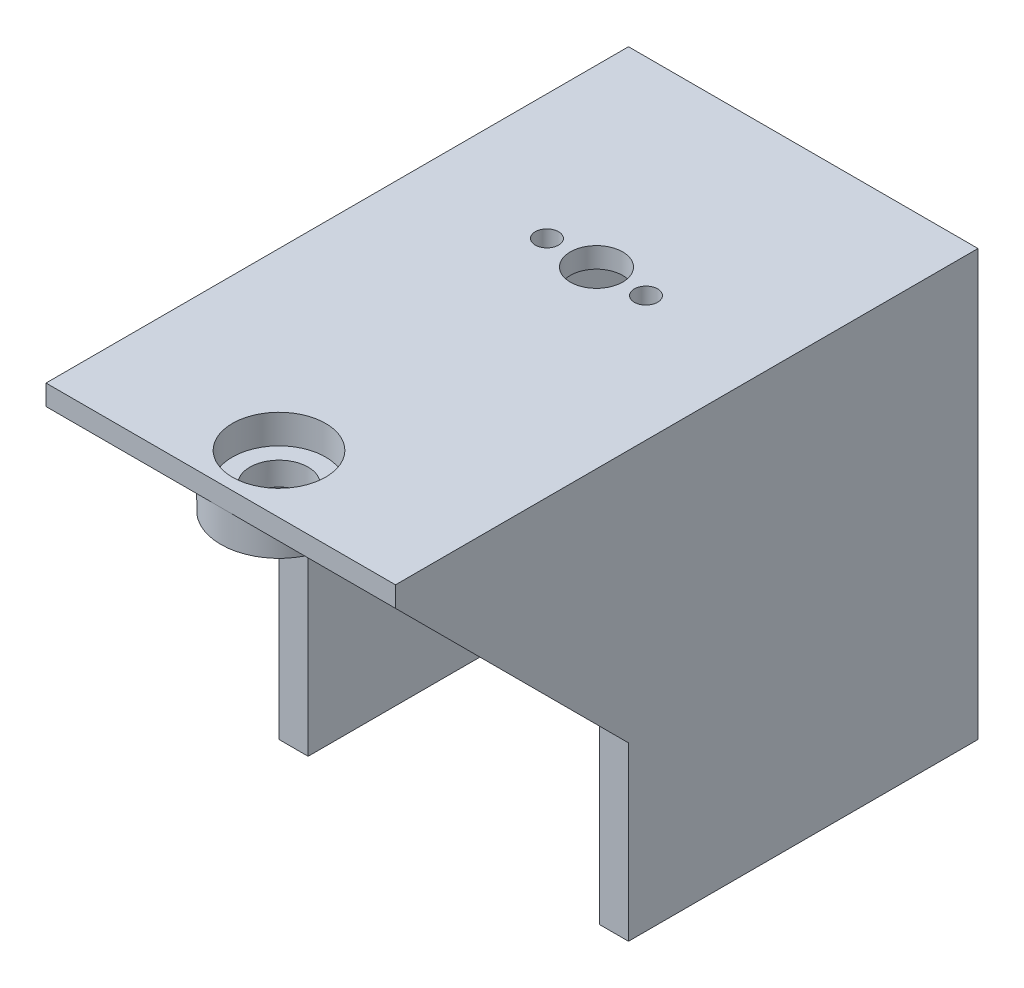
ISO-10303-21;
HEADER;
FILE_DESCRIPTION(('STEP AP214'),'2;1');
FILE_NAME('part.step','',(''),(''),'','','');
FILE_SCHEMA(('AUTOMOTIVE_DESIGN { 1 0 10303 214 1 1 1 1 }'));
ENDSEC;
DATA;
#1=APPLICATION_CONTEXT('core data for automotive mechanical design processes');
#2=APPLICATION_PROTOCOL_DEFINITION('international standard','automotive_design',2000,#1);
#3=PRODUCT_CONTEXT('',#1,'mechanical');
#4=PRODUCT('Part','Part','',(#3));
#5=PRODUCT_RELATED_PRODUCT_CATEGORY('part','',(#4));
#6=PRODUCT_DEFINITION_FORMATION('','',#4);
#7=PRODUCT_DEFINITION_CONTEXT('part definition',#1,'design');
#8=PRODUCT_DEFINITION('design','',#6,#7);
#9=PRODUCT_DEFINITION_SHAPE('','',#8);
#10=(LENGTH_UNIT() NAMED_UNIT(*) SI_UNIT(.MILLI.,.METRE.));
#11=(NAMED_UNIT(*) PLANE_ANGLE_UNIT() SI_UNIT($,.RADIAN.));
#12=(NAMED_UNIT(*) SI_UNIT($,.STERADIAN.) SOLID_ANGLE_UNIT());
#13=UNCERTAINTY_MEASURE_WITH_UNIT(LENGTH_MEASURE(1.E-05),#10,'distance_accuracy_value','');
#14=(GEOMETRIC_REPRESENTATION_CONTEXT(3) GLOBAL_UNCERTAINTY_ASSIGNED_CONTEXT((#13)) GLOBAL_UNIT_ASSIGNED_CONTEXT((#10,
#11,#12)) REPRESENTATION_CONTEXT('',''));
#15=CARTESIAN_POINT('',(0.,0.,0.));
#16=DIRECTION('',(0.,0.,1.));
#17=DIRECTION('',(1.,0.,0.));
#18=AXIS2_PLACEMENT_3D('',#15,#16,#17);
#19=CARTESIAN_POINT('',(-30.,73.,30.));
#20=DIRECTION('',(0.,0.,-1.));
#21=DIRECTION('',(-1.,0.,0.));
#22=AXIS2_PLACEMENT_3D('',#19,#20,#21);
#23=PLANE('',#22);
#24=DIRECTION('',(0.,-1.,0.));
#25=VECTOR('',#24,1.);
#26=CARTESIAN_POINT('',(-25.,0.,30.));
#27=LINE('',#26,#25);
#28=CARTESIAN_POINT('',(-25.,29.5000000000001,30.));
#29=VERTEX_POINT('',#28);
#30=CARTESIAN_POINT('',(-25.,0.,30.));
#31=VERTEX_POINT('',#30);
#32=EDGE_CURVE('E305',#29,#31,#27,.T.);
#33=ORIENTED_EDGE('',*,*,#32,.F.);
#34=DIRECTION('',(-1.,0.,0.));
#35=VECTOR('',#34,1.);
#36=CARTESIAN_POINT('',(-30.,29.5000000000001,30.));
#37=LINE('',#36,#35);
#38=CARTESIAN_POINT('',(-30.,29.5000000000001,30.));
#39=VERTEX_POINT('',#38);
#40=EDGE_CURVE('E251',#29,#39,#37,.T.);
#41=ORIENTED_EDGE('',*,*,#40,.T.);
#42=DIRECTION('',(0.,-1.,0.));
#43=VECTOR('',#42,1.);
#44=CARTESIAN_POINT('',(-30.,73.,30.));
#45=LINE('',#44,#43);
#46=CARTESIAN_POINT('',(-30.,0.,30.));
#47=VERTEX_POINT('',#46);
#48=EDGE_CURVE('E167',#39,#47,#45,.T.);
#49=ORIENTED_EDGE('',*,*,#48,.T.);
#50=DIRECTION('',(1.,0.,0.));
#51=VECTOR('',#50,1.);
#52=CARTESIAN_POINT('',(-30.,0.,30.));
#53=LINE('',#52,#51);
#54=EDGE_CURVE('E210',#47,#31,#53,.T.);
#55=ORIENTED_EDGE('',*,*,#54,.T.);
#56=EDGE_LOOP('',(#33,#41,#49,#55));
#57=FACE_BOUND('',#56,.T.);
#58=ADVANCED_FACE('F43',(#57),#23,.F.);
#59=DIRECTION('',(0.,-1.,0.));
#60=VECTOR('',#59,1.);
#61=CARTESIAN_POINT('',(30.,73.,30.));
#62=LINE('',#61,#60);
#63=CARTESIAN_POINT('',(30.,29.5000000000001,30.));
#64=VERTEX_POINT('',#63);
#65=CARTESIAN_POINT('',(30.,0.,30.));
#66=VERTEX_POINT('',#65);
#67=EDGE_CURVE('E222',#64,#66,#62,.T.);
#68=ORIENTED_EDGE('',*,*,#67,.F.);
#69=DIRECTION('',(-1.,0.,0.));
#70=VECTOR('',#69,1.);
#71=CARTESIAN_POINT('',(20.,29.5000000000001,30.));
#72=LINE('',#71,#70);
#73=CARTESIAN_POINT('',(25.,29.5000000000001,30.));
#74=VERTEX_POINT('',#73);
#75=EDGE_CURVE('E249',#64,#74,#72,.T.);
#76=ORIENTED_EDGE('',*,*,#75,.T.);
#77=DIRECTION('',(0.,1.,0.));
#78=VECTOR('',#77,1.);
#79=CARTESIAN_POINT('',(25.,0.,30.));
#80=LINE('',#79,#78);
#81=CARTESIAN_POINT('',(25.,0.,30.));
#82=VERTEX_POINT('',#81);
#83=EDGE_CURVE('E300',#82,#74,#80,.T.);
#84=ORIENTED_EDGE('',*,*,#83,.F.);
#85=EDGE_CURVE('E215',#82,#66,#53,.T.);
#86=ORIENTED_EDGE('',*,*,#85,.T.);
#87=EDGE_LOOP('',(#68,#76,#84,#86));
#88=FACE_BOUND('',#87,.T.);
#89=ADVANCED_FACE('F370',(#88),#23,.F.);
#90=CARTESIAN_POINT('',(0.,0.,0.));
#91=DIRECTION('',(0.,-1.,0.));
#92=DIRECTION('',(0.,0.,-1.));
#93=AXIS2_PLACEMENT_3D('',#90,#91,#92);
#94=PLANE('',#93);
#95=CARTESIAN_POINT('',(-27.5,0.,0.));
#96=DIRECTION('',(0.,-1.,0.));
#97=DIRECTION('',(0.,0.,-1.));
#98=AXIS2_PLACEMENT_3D('',#95,#96,#97);
#99=CIRCLE('',#98,1.69999999999999);
#100=CARTESIAN_POINT('',(-27.5,0.,-1.69999999999999));
#101=VERTEX_POINT('',#100);
#102=EDGE_CURVE('E360',#101,#101,#99,.T.);
#103=ORIENTED_EDGE('',*,*,#102,.F.);
#104=EDGE_LOOP('',(#103));
#105=FACE_BOUND('',#104,.T.);
#106=CARTESIAN_POINT('',(-27.5,0.,20.));
#107=DIRECTION('',(0.,-1.,0.));
#108=DIRECTION('',(0.,0.,-1.));
#109=AXIS2_PLACEMENT_3D('',#106,#107,#108);
#110=CIRCLE('',#109,1.69999999999999);
#111=CARTESIAN_POINT('',(-27.5,0.,18.3));
#112=VERTEX_POINT('',#111);
#113=EDGE_CURVE('E348',#112,#112,#110,.T.);
#114=ORIENTED_EDGE('',*,*,#113,.F.);
#115=EDGE_LOOP('',(#114));
#116=FACE_BOUND('',#115,.T.);
#117=CARTESIAN_POINT('',(-27.5,0.,-20.));
#118=DIRECTION('',(0.,-1.,0.));
#119=DIRECTION('',(0.,0.,-1.));
#120=AXIS2_PLACEMENT_3D('',#117,#118,#119);
#121=CIRCLE('',#120,1.69999999999999);
#122=CARTESIAN_POINT('',(-27.5,0.,-21.7));
#123=VERTEX_POINT('',#122);
#124=EDGE_CURVE('E342',#123,#123,#121,.T.);
#125=ORIENTED_EDGE('',*,*,#124,.F.);
#126=EDGE_LOOP('',(#125));
#127=FACE_BOUND('',#126,.T.);
#128=DIRECTION('',(0.,0.,1.));
#129=VECTOR('',#128,1.);
#130=CARTESIAN_POINT('',(-25.,0.,-30.001));
#131=LINE('',#130,#129);
#132=CARTESIAN_POINT('',(-25.,0.,-30.));
#133=VERTEX_POINT('',#132);
#134=EDGE_CURVE('E218',#133,#31,#131,.T.);
#135=ORIENTED_EDGE('',*,*,#134,.T.);
#136=ORIENTED_EDGE('',*,*,#54,.F.);
#137=DIRECTION('',(0.,0.,1.));
#138=VECTOR('',#137,1.);
#139=CARTESIAN_POINT('',(-30.,0.,30.));
#140=LINE('',#139,#138);
#141=CARTESIAN_POINT('',(-30.,0.,-30.));
#142=VERTEX_POINT('',#141);
#143=EDGE_CURVE('E230',#142,#47,#140,.T.);
#144=ORIENTED_EDGE('',*,*,#143,.F.);
#145=DIRECTION('',(-1.,0.,0.));
#146=VECTOR('',#145,1.);
#147=CARTESIAN_POINT('',(-30.,0.,-30.));
#148=LINE('',#147,#146);
#149=EDGE_CURVE('E225',#133,#142,#148,.T.);
#150=ORIENTED_EDGE('',*,*,#149,.F.);
#151=EDGE_LOOP('',(#135,#136,#144,#150));
#152=FACE_BOUND('',#151,.T.);
#153=ADVANCED_FACE('F367',(#105,#116,#127,#152),#94,.T.);
#154=CARTESIAN_POINT('',(30.,73.,30.));
#155=DIRECTION('',(-1.,0.,0.));
#156=DIRECTION('',(0.,0.,1.));
#157=AXIS2_PLACEMENT_3D('',#154,#155,#156);
#158=PLANE('',#157);
#159=DIRECTION('',(0.,0.,-1.));
#160=VECTOR('',#159,1.);
#161=CARTESIAN_POINT('',(30.,0.,30.));
#162=LINE('',#161,#160);
#163=CARTESIAN_POINT('',(30.,0.,-30.));
#164=VERTEX_POINT('',#163);
#165=EDGE_CURVE('E223',#66,#164,#162,.T.);
#166=ORIENTED_EDGE('',*,*,#165,.T.);
#167=DIRECTION('',(0.,-1.,0.));
#168=VECTOR('',#167,1.);
#169=CARTESIAN_POINT('',(30.,73.,-30.));
#170=LINE('',#169,#168);
#171=CARTESIAN_POINT('',(30.,73.,-30.));
#172=VERTEX_POINT('',#171);
#173=EDGE_CURVE('E207',#172,#164,#170,.T.);
#174=ORIENTED_EDGE('',*,*,#173,.F.);
#175=DIRECTION('',(0.,0.,-1.));
#176=VECTOR('',#175,1.);
#177=CARTESIAN_POINT('',(30.,73.,30.));
#178=LINE('',#177,#176);
#179=CARTESIAN_POINT('',(30.,73.,70.));
#180=VERTEX_POINT('',#179);
#181=EDGE_CURVE('E205',#180,#172,#178,.T.);
#182=ORIENTED_EDGE('',*,*,#181,.F.);
#183=DIRECTION('',(0.,1.,0.));
#184=VECTOR('',#183,1.);
#185=CARTESIAN_POINT('',(30.,73.,70.));
#186=LINE('',#185,#184);
#187=CARTESIAN_POINT('',(30.,69.5,70.));
#188=VERTEX_POINT('',#187);
#189=EDGE_CURVE('E186',#188,#180,#186,.T.);
#190=ORIENTED_EDGE('',*,*,#189,.F.);
#191=DIRECTION('',(0.,0.707106781186544,0.707106781186551));
#192=VECTOR('',#191,1.);
#193=CARTESIAN_POINT('',(30.,51.2499999999998,51.7499999999999));
#194=LINE('',#193,#192);
#195=EDGE_CURVE('E201',#188,#64,#194,.F.);
#196=ORIENTED_EDGE('',*,*,#195,.T.);
#197=ORIENTED_EDGE('',*,*,#67,.T.);
#198=EDGE_LOOP('',(#166,#174,#182,#190,#196,#197));
#199=FACE_BOUND('',#198,.T.);
#200=ADVANCED_FACE('F200',(#199),#158,.F.);
#201=CARTESIAN_POINT('',(-30.,73.,-30.));
#202=DIRECTION('',(0.,0.,1.));
#203=DIRECTION('',(1.,0.,0.));
#204=AXIS2_PLACEMENT_3D('',#201,#202,#203);
#205=PLANE('',#204);
#206=DIRECTION('',(1.,0.,0.));
#207=VECTOR('',#206,1.);
#208=CARTESIAN_POINT('',(-25.,69.5,-30.));
#209=LINE('',#208,#207);
#210=CARTESIAN_POINT('',(-20.,69.5,-30.));
#211=VERTEX_POINT('',#210);
#212=CARTESIAN_POINT('',(20.,69.5,-30.));
#213=VERTEX_POINT('',#212);
#214=EDGE_CURVE('E288',#211,#213,#209,.T.);
#215=ORIENTED_EDGE('',*,*,#214,.F.);
#216=DIRECTION('',(0.707106781186545,0.70710678118655,0.));
#217=VECTOR('',#216,1.);
#218=CARTESIAN_POINT('',(-23.25,66.25,-30.));
#219=LINE('',#218,#217);
#220=CARTESIAN_POINT('',(-25.,64.5,-30.));
#221=VERTEX_POINT('',#220);
#222=EDGE_CURVE('E247',#211,#221,#219,.F.);
#223=ORIENTED_EDGE('',*,*,#222,.T.);
#224=DIRECTION('',(0.,1.,0.));
#225=VECTOR('',#224,1.);
#226=CARTESIAN_POINT('',(-25.,0.,-30.));
#227=LINE('',#226,#225);
#228=EDGE_CURVE('E308',#133,#221,#227,.T.);
#229=ORIENTED_EDGE('',*,*,#228,.F.);
#230=ORIENTED_EDGE('',*,*,#149,.T.);
#231=DIRECTION('',(0.,-1.,0.));
#232=VECTOR('',#231,1.);
#233=CARTESIAN_POINT('',(-30.,73.,-30.));
#234=LINE('',#233,#232);
#235=CARTESIAN_POINT('',(-30.,73.,-30.));
#236=VERTEX_POINT('',#235);
#237=EDGE_CURVE('E234',#236,#142,#234,.T.);
#238=ORIENTED_EDGE('',*,*,#237,.F.);
#239=DIRECTION('',(-1.,0.,0.));
#240=VECTOR('',#239,1.);
#241=CARTESIAN_POINT('',(-30.,73.,-30.));
#242=LINE('',#241,#240);
#243=EDGE_CURVE('E209',#172,#236,#242,.T.);
#244=ORIENTED_EDGE('',*,*,#243,.F.);
#245=ORIENTED_EDGE('',*,*,#173,.T.);
#246=CARTESIAN_POINT('',(25.,0.,-30.));
#247=VERTEX_POINT('',#246);
#248=EDGE_CURVE('E227',#164,#247,#148,.T.);
#249=ORIENTED_EDGE('',*,*,#248,.T.);
#250=DIRECTION('',(0.,-1.,0.));
#251=VECTOR('',#250,1.);
#252=CARTESIAN_POINT('',(25.,0.,-30.));
#253=LINE('',#252,#251);
#254=CARTESIAN_POINT('',(25.,64.5,-30.));
#255=VERTEX_POINT('',#254);
#256=EDGE_CURVE('E313',#255,#247,#253,.T.);
#257=ORIENTED_EDGE('',*,*,#256,.F.);
#258=DIRECTION('',(0.707106781186551,-0.707106781186544,0.));
#259=VECTOR('',#258,1.);
#260=CARTESIAN_POINT('',(-6.75000000000029,96.25,-30.));
#261=LINE('',#260,#259);
#262=EDGE_CURVE('E245',#255,#213,#261,.F.);
#263=ORIENTED_EDGE('',*,*,#262,.T.);
#264=EDGE_LOOP('',(#215,#223,#229,#230,#238,#244,#245,#249,#257,#263));
#265=FACE_BOUND('',#264,.T.);
#266=ADVANCED_FACE('F385',(#265),#205,.F.);
#267=CARTESIAN_POINT('',(-30.,73.,30.));
#268=DIRECTION('',(1.,0.,0.));
#269=DIRECTION('',(0.,0.,-1.));
#270=AXIS2_PLACEMENT_3D('',#267,#268,#269);
#271=PLANE('',#270);
#272=ORIENTED_EDGE('',*,*,#143,.T.);
#273=ORIENTED_EDGE('',*,*,#48,.F.);
#274=DIRECTION('',(0.,-0.707106781186544,-0.707106781186551));
#275=VECTOR('',#274,1.);
#276=CARTESIAN_POINT('',(-30.,51.2499999999998,51.7499999999999));
#277=LINE('',#276,#275);
#278=CARTESIAN_POINT('',(-30.,69.5,70.));
#279=VERTEX_POINT('',#278);
#280=EDGE_CURVE('E11',#39,#279,#277,.F.);
#281=ORIENTED_EDGE('',*,*,#280,.T.);
#282=DIRECTION('',(0.,-1.,0.));
#283=VECTOR('',#282,1.);
#284=CARTESIAN_POINT('',(-30.,73.,70.));
#285=LINE('',#284,#283);
#286=CARTESIAN_POINT('',(-30.,73.,70.));
#287=VERTEX_POINT('',#286);
#288=EDGE_CURVE('E166',#287,#279,#285,.T.);
#289=ORIENTED_EDGE('',*,*,#288,.F.);
#290=DIRECTION('',(0.,0.,1.));
#291=VECTOR('',#290,1.);
#292=CARTESIAN_POINT('',(-30.,73.,30.));
#293=LINE('',#292,#291);
#294=EDGE_CURVE('E212',#236,#287,#293,.T.);
#295=ORIENTED_EDGE('',*,*,#294,.F.);
#296=ORIENTED_EDGE('',*,*,#237,.T.);
#297=EDGE_LOOP('',(#272,#273,#281,#289,#295,#296));
#298=FACE_BOUND('',#297,.T.);
#299=ADVANCED_FACE('F164',(#298),#271,.F.);
#300=CARTESIAN_POINT('',(0.,73.,0.));
#301=DIRECTION('',(0.,-1.,0.));
#302=DIRECTION('',(0.,0.,-1.));
#303=AXIS2_PLACEMENT_3D('',#300,#301,#302);
#304=PLANE('',#303);
#305=CARTESIAN_POINT('',(0.,73.,5.5));
#306=DIRECTION('',(0.,1.,0.));
#307=DIRECTION('',(0.,0.,1.));
#308=AXIS2_PLACEMENT_3D('',#305,#306,#307);
#309=CIRCLE('',#308,4.5);
#310=CARTESIAN_POINT('',(0.,73.,10.));
#311=VERTEX_POINT('',#310);
#312=EDGE_CURVE('E275',#311,#311,#309,.T.);
#313=ORIENTED_EDGE('',*,*,#312,.F.);
#314=EDGE_LOOP('',(#313));
#315=FACE_BOUND('',#314,.T.);
#316=CARTESIAN_POINT('',(0.,73.,60.));
#317=DIRECTION('',(0.,1.,0.));
#318=DIRECTION('',(0.,0.,1.));
#319=AXIS2_PLACEMENT_3D('',#316,#317,#318);
#320=CIRCLE('',#319,8.);
#321=CARTESIAN_POINT('',(0.,73.,68.));
#322=VERTEX_POINT('',#321);
#323=EDGE_CURVE('E263',#322,#322,#320,.T.);
#324=ORIENTED_EDGE('',*,*,#323,.F.);
#325=EDGE_LOOP('',(#324));
#326=FACE_BOUND('',#325,.T.);
#327=CARTESIAN_POINT('',(8.5,73.,5.5));
#328=DIRECTION('',(0.,1.,0.));
#329=DIRECTION('',(0.,0.,1.));
#330=AXIS2_PLACEMENT_3D('',#327,#328,#329);
#331=CIRCLE('',#330,2.);
#332=CARTESIAN_POINT('',(8.5,73.,7.5));
#333=VERTEX_POINT('',#332);
#334=EDGE_CURVE('E319',#333,#333,#331,.T.);
#335=ORIENTED_EDGE('',*,*,#334,.F.);
#336=EDGE_LOOP('',(#335));
#337=FACE_BOUND('',#336,.T.);
#338=CARTESIAN_POINT('',(-8.5,73.,5.5));
#339=DIRECTION('',(0.,1.,0.));
#340=DIRECTION('',(0.,0.,1.));
#341=AXIS2_PLACEMENT_3D('',#338,#339,#340);
#342=CIRCLE('',#341,2.);
#343=CARTESIAN_POINT('',(-8.5,73.,7.5));
#344=VERTEX_POINT('',#343);
#345=EDGE_CURVE('E320',#344,#344,#342,.T.);
#346=ORIENTED_EDGE('',*,*,#345,.F.);
#347=EDGE_LOOP('',(#346));
#348=FACE_BOUND('',#347,.T.);
#349=ORIENTED_EDGE('',*,*,#294,.T.);
#350=DIRECTION('',(-1.,0.,0.));
#351=VECTOR('',#350,1.);
#352=CARTESIAN_POINT('',(-30.,73.,70.));
#353=LINE('',#352,#351);
#354=EDGE_CURVE('E178',#180,#287,#353,.T.);
#355=ORIENTED_EDGE('',*,*,#354,.F.);
#356=ORIENTED_EDGE('',*,*,#181,.T.);
#357=ORIENTED_EDGE('',*,*,#243,.T.);
#358=EDGE_LOOP('',(#349,#355,#356,#357));
#359=FACE_BOUND('',#358,.T.);
#360=ADVANCED_FACE('F402',(#315,#326,#337,#348,#359),#304,.F.);
#361=CARTESIAN_POINT('',(27.5,0.,1.78350552535857));
#362=DIRECTION('',(0.,-1.,0.));
#363=DIRECTION('',(0.,0.,-1.));
#364=AXIS2_PLACEMENT_3D('',#361,#362,#363);
#365=CIRCLE('',#364,1.69999999999999);
#366=CARTESIAN_POINT('',(27.5,0.,0.0835055253585759));
#367=VERTEX_POINT('',#366);
#368=EDGE_CURVE('E354',#367,#367,#365,.T.);
#369=ORIENTED_EDGE('',*,*,#368,.F.);
#370=EDGE_LOOP('',(#369));
#371=FACE_BOUND('',#370,.T.);
#372=CARTESIAN_POINT('',(27.5,0.,-20.));
#373=DIRECTION('',(0.,-1.,0.));
#374=DIRECTION('',(0.,0.,-1.));
#375=AXIS2_PLACEMENT_3D('',#372,#373,#374);
#376=CIRCLE('',#375,1.7);
#377=CARTESIAN_POINT('',(27.5,0.,-21.7));
#378=VERTEX_POINT('',#377);
#379=EDGE_CURVE('E336',#378,#378,#376,.T.);
#380=ORIENTED_EDGE('',*,*,#379,.F.);
#381=EDGE_LOOP('',(#380));
#382=FACE_BOUND('',#381,.T.);
#383=CARTESIAN_POINT('',(27.5,0.,20.));
#384=DIRECTION('',(0.,-1.,0.));
#385=DIRECTION('',(0.,0.,-1.));
#386=AXIS2_PLACEMENT_3D('',#383,#384,#385);
#387=CIRCLE('',#386,1.7);
#388=CARTESIAN_POINT('',(27.5,0.,18.3));
#389=VERTEX_POINT('',#388);
#390=EDGE_CURVE('E330',#389,#389,#387,.T.);
#391=ORIENTED_EDGE('',*,*,#390,.F.);
#392=EDGE_LOOP('',(#391));
#393=FACE_BOUND('',#392,.T.);
#394=DIRECTION('',(0.,0.,1.));
#395=VECTOR('',#394,1.);
#396=CARTESIAN_POINT('',(25.,0.,-30.001));
#397=LINE('',#396,#395);
#398=EDGE_CURVE('E226',#247,#82,#397,.T.);
#399=ORIENTED_EDGE('',*,*,#398,.F.);
#400=ORIENTED_EDGE('',*,*,#248,.F.);
#401=ORIENTED_EDGE('',*,*,#165,.F.);
#402=ORIENTED_EDGE('',*,*,#85,.F.);
#403=EDGE_LOOP('',(#399,#400,#401,#402));
#404=FACE_BOUND('',#403,.T.);
#405=ADVANCED_FACE('F372',(#371,#382,#393,#404),#94,.T.);
#406=CARTESIAN_POINT('',(-25.,0.,-30.001));
#407=DIRECTION('',(-1.,0.,0.));
#408=DIRECTION('',(0.,0.,1.));
#409=AXIS2_PLACEMENT_3D('',#406,#407,#408);
#410=PLANE('',#409);
#411=ORIENTED_EDGE('',*,*,#228,.T.);
#412=DIRECTION('',(0.,0.,1.));
#413=VECTOR('',#412,1.);
#414=CARTESIAN_POINT('',(-25.,64.5,30.));
#415=LINE('',#414,#413);
#416=CARTESIAN_POINT('',(-25.,64.5,65.0000000000002));
#417=VERTEX_POINT('',#416);
#418=EDGE_CURVE('E66',#221,#417,#415,.T.);
#419=ORIENTED_EDGE('',*,*,#418,.T.);
#420=DIRECTION('',(0.,0.707106781186544,0.707106781186551));
#421=VECTOR('',#420,1.);
#422=CARTESIAN_POINT('',(-25.,-15.2504999999998,-14.7505000000004));
#423=LINE('',#422,#421);
#424=EDGE_CURVE('E53',#417,#29,#423,.F.);
#425=ORIENTED_EDGE('',*,*,#424,.T.);
#426=ORIENTED_EDGE('',*,*,#32,.T.);
#427=ORIENTED_EDGE('',*,*,#134,.F.);
#428=EDGE_LOOP('',(#411,#419,#425,#426,#427));
#429=FACE_BOUND('',#428,.T.);
#430=ADVANCED_FACE('F387',(#429),#410,.F.);
#431=CARTESIAN_POINT('',(-25.,69.5,-30.001));
#432=DIRECTION('',(0.,1.,0.));
#433=DIRECTION('',(0.,0.,1.));
#434=AXIS2_PLACEMENT_3D('',#431,#432,#433);
#435=PLANE('',#434);
#436=CARTESIAN_POINT('',(0.,69.5,5.5));
#437=DIRECTION('',(0.,1.,0.));
#438=DIRECTION('',(0.,0.,1.));
#439=AXIS2_PLACEMENT_3D('',#436,#437,#438);
#440=CIRCLE('',#439,4.5);
#441=CARTESIAN_POINT('',(0.,69.5,10.));
#442=VERTEX_POINT('',#441);
#443=EDGE_CURVE('E48',#442,#442,#440,.T.);
#444=ORIENTED_EDGE('',*,*,#443,.T.);
#445=EDGE_LOOP('',(#444));
#446=FACE_BOUND('',#445,.T.);
#447=CARTESIAN_POINT('',(8.5,69.5,5.5));
#448=DIRECTION('',(0.,1.,0.));
#449=DIRECTION('',(0.,0.,1.));
#450=AXIS2_PLACEMENT_3D('',#447,#448,#449);
#451=CIRCLE('',#450,2.);
#452=CARTESIAN_POINT('',(8.5,69.5,7.5));
#453=VERTEX_POINT('',#452);
#454=EDGE_CURVE('E315',#453,#453,#451,.F.);
#455=ORIENTED_EDGE('',*,*,#454,.F.);
#456=EDGE_LOOP('',(#455));
#457=FACE_BOUND('',#456,.T.);
#458=CARTESIAN_POINT('',(-8.5,69.5,5.5));
#459=DIRECTION('',(0.,1.,0.));
#460=DIRECTION('',(0.,0.,1.));
#461=AXIS2_PLACEMENT_3D('',#458,#459,#460);
#462=CIRCLE('',#461,2.);
#463=CARTESIAN_POINT('',(-8.5,69.5,7.5));
#464=VERTEX_POINT('',#463);
#465=EDGE_CURVE('E316',#464,#464,#462,.F.);
#466=ORIENTED_EDGE('',*,*,#465,.F.);
#467=EDGE_LOOP('',(#466));
#468=FACE_BOUND('',#467,.T.);
#469=DIRECTION('',(1.,0.,0.));
#470=VECTOR('',#469,1.);
#471=CARTESIAN_POINT('',(-30.,69.5,70.));
#472=LINE('',#471,#470);
#473=CARTESIAN_POINT('',(0.,69.5,70.));
#474=VERTEX_POINT('',#473);
#475=CARTESIAN_POINT('',(20.,69.5,70.));
#476=VERTEX_POINT('',#475);
#477=EDGE_CURVE('E189',#474,#476,#472,.T.);
#478=ORIENTED_EDGE('',*,*,#477,.F.);
#479=CARTESIAN_POINT('',(0.,69.5,60.));
#480=DIRECTION('',(0.,1.,0.));
#481=DIRECTION('',(0.,0.,1.));
#482=AXIS2_PLACEMENT_3D('',#479,#480,#481);
#483=CIRCLE('',#482,10.);
#484=EDGE_CURVE('E59',#474,#474,#483,.T.);
#485=ORIENTED_EDGE('',*,*,#484,.T.);
#486=CARTESIAN_POINT('',(-20.,69.5,70.));
#487=VERTEX_POINT('',#486);
#488=EDGE_CURVE('E187',#487,#474,#472,.T.);
#489=ORIENTED_EDGE('',*,*,#488,.F.);
#490=DIRECTION('',(0.,0.,-1.));
#491=VECTOR('',#490,1.);
#492=CARTESIAN_POINT('',(-20.,69.5,-30.));
#493=LINE('',#492,#491);
#494=EDGE_CURVE('E238',#487,#211,#493,.T.);
#495=ORIENTED_EDGE('',*,*,#494,.T.);
#496=ORIENTED_EDGE('',*,*,#214,.T.);
#497=DIRECTION('',(0.,0.,1.));
#498=VECTOR('',#497,1.);
#499=CARTESIAN_POINT('',(20.,69.5,30.));
#500=LINE('',#499,#498);
#501=EDGE_CURVE('E240',#213,#476,#500,.T.);
#502=ORIENTED_EDGE('',*,*,#501,.T.);
#503=EDGE_LOOP('',(#478,#485,#489,#495,#496,#502));
#504=FACE_BOUND('',#503,.T.);
#505=ADVANCED_FACE('F284',(#446,#457,#468,#504),#435,.F.);
#506=CARTESIAN_POINT('',(25.,0.,-30.001));
#507=DIRECTION('',(1.,0.,0.));
#508=DIRECTION('',(0.,0.,-1.));
#509=AXIS2_PLACEMENT_3D('',#506,#507,#508);
#510=PLANE('',#509);
#511=ORIENTED_EDGE('',*,*,#83,.T.);
#512=DIRECTION('',(0.,-0.707106781186544,-0.707106781186551));
#513=VECTOR('',#512,1.);
#514=CARTESIAN_POINT('',(25.,-15.2504999999998,-14.7505000000004));
#515=LINE('',#514,#513);
#516=CARTESIAN_POINT('',(25.,64.5,65.0000000000003));
#517=VERTEX_POINT('',#516);
#518=EDGE_CURVE('E254',#74,#517,#515,.F.);
#519=ORIENTED_EDGE('',*,*,#518,.T.);
#520=DIRECTION('',(0.,0.,-1.));
#521=VECTOR('',#520,1.);
#522=CARTESIAN_POINT('',(25.,64.5,-30.));
#523=LINE('',#522,#521);
#524=EDGE_CURVE('E242',#517,#255,#523,.T.);
#525=ORIENTED_EDGE('',*,*,#524,.T.);
#526=ORIENTED_EDGE('',*,*,#256,.T.);
#527=ORIENTED_EDGE('',*,*,#398,.T.);
#528=EDGE_LOOP('',(#511,#519,#525,#526,#527));
#529=FACE_BOUND('',#528,.T.);
#530=ADVANCED_FACE('F297',(#529),#510,.F.);
#531=CARTESIAN_POINT('',(-8.5,-0.001000000000001,5.5));
#532=DIRECTION('',(0.,1.,0.));
#533=DIRECTION('',(0.,0.,1.));
#534=AXIS2_PLACEMENT_3D('',#531,#532,#533);
#535=CYLINDRICAL_SURFACE('',#534,2.);
#536=ORIENTED_EDGE('',*,*,#345,.T.);
#537=EDGE_LOOP('',(#536));
#538=FACE_BOUND('',#537,.T.);
#539=ORIENTED_EDGE('',*,*,#465,.T.);
#540=EDGE_LOOP('',(#539));
#541=FACE_BOUND('',#540,.T.);
#542=ADVANCED_FACE('F481',(#538,#541),#535,.F.);
#543=CARTESIAN_POINT('',(8.5,-0.001000000000001,5.5));
#544=DIRECTION('',(0.,1.,0.));
#545=DIRECTION('',(0.,0.,1.));
#546=AXIS2_PLACEMENT_3D('',#543,#544,#545);
#547=CYLINDRICAL_SURFACE('',#546,2.);
#548=ORIENTED_EDGE('',*,*,#334,.T.);
#549=EDGE_LOOP('',(#548));
#550=FACE_BOUND('',#549,.T.);
#551=ORIENTED_EDGE('',*,*,#454,.T.);
#552=EDGE_LOOP('',(#551));
#553=FACE_BOUND('',#552,.T.);
#554=ADVANCED_FACE('F412',(#550,#553),#547,.F.);
#555=CARTESIAN_POINT('',(20.,69.5,-30.001));
#556=DIRECTION('',(-0.707106781186544,-0.707106781186551,0.));
#557=DIRECTION('',(0.,0.,-1.));
#558=AXIS2_PLACEMENT_3D('',#555,#556,#557);
#559=PLANE('',#558);
#560=ORIENTED_EDGE('',*,*,#262,.F.);
#561=ORIENTED_EDGE('',*,*,#524,.F.);
#562=DIRECTION('',(-0.577350269189628,0.577350269189622,0.577350269189628));
#563=VECTOR('',#562,1.);
#564=CARTESIAN_POINT('',(53.333666666667,36.1663333333334,36.6663333333333));
#565=LINE('',#564,#563);
#566=EDGE_CURVE('E257',#517,#476,#565,.T.);
#567=ORIENTED_EDGE('',*,*,#566,.T.);
#568=ORIENTED_EDGE('',*,*,#501,.F.);
#569=EDGE_LOOP('',(#560,#561,#567,#568));
#570=FACE_BOUND('',#569,.T.);
#571=ADVANCED_FACE('F291',(#570),#559,.T.);
#572=CARTESIAN_POINT('',(-25.,64.5,-30.001));
#573=DIRECTION('',(0.70710678118655,-0.707106781186545,0.));
#574=DIRECTION('',(0.,0.,-1.));
#575=AXIS2_PLACEMENT_3D('',#572,#573,#574);
#576=PLANE('',#575);
#577=ORIENTED_EDGE('',*,*,#222,.F.);
#578=ORIENTED_EDGE('',*,*,#494,.F.);
#579=DIRECTION('',(-0.577350269189621,-0.577350269189625,-0.577350269189631));
#580=VECTOR('',#579,1.);
#581=CARTESIAN_POINT('',(-56.6670000000001,32.8329999999996,33.3329999999995));
#582=LINE('',#581,#580);
#583=EDGE_CURVE('E184',#487,#417,#582,.T.);
#584=ORIENTED_EDGE('',*,*,#583,.T.);
#585=ORIENTED_EDGE('',*,*,#418,.F.);
#586=EDGE_LOOP('',(#577,#578,#584,#585));
#587=FACE_BOUND('',#586,.T.);
#588=ADVANCED_FACE('F389',(#587),#576,.T.);
#589=CARTESIAN_POINT('',(27.5,40.,20.));
#590=DIRECTION('',(0.,-1.,0.));
#591=DIRECTION('',(0.,0.,-1.));
#592=AXIS2_PLACEMENT_3D('',#589,#590,#591);
#593=CONICAL_SURFACE('',#592,1.69999999999999,1.02974425867665);
#594=CARTESIAN_POINT('',(27.5,41.0214630523469,20.));
#595=VERTEX_POINT('',#594);
#596=VERTEX_LOOP('',#595);
#597=FACE_BOUND('',#596,.T.);
#598=CARTESIAN_POINT('',(27.5,40.,20.));
#599=DIRECTION('',(0.,-1.,0.));
#600=DIRECTION('',(0.,0.,-1.));
#601=AXIS2_PLACEMENT_3D('',#598,#599,#600);
#602=CIRCLE('',#601,1.69999999999999);
#603=CARTESIAN_POINT('',(27.5,40.,18.3));
#604=VERTEX_POINT('',#603);
#605=EDGE_CURVE('E323',#604,#604,#602,.T.);
#606=ORIENTED_EDGE('',*,*,#605,.T.);
#607=EDGE_LOOP('',(#606));
#608=FACE_BOUND('',#607,.T.);
#609=ADVANCED_FACE('F417',(#597,#608),#593,.F.);
#610=CARTESIAN_POINT('',(27.5,0.,20.));
#611=DIRECTION('',(0.,-1.,0.));
#612=DIRECTION('',(0.,0.,-1.));
#613=AXIS2_PLACEMENT_3D('',#610,#611,#612);
#614=CYLINDRICAL_SURFACE('',#613,1.69999999999999);
#615=ORIENTED_EDGE('',*,*,#605,.F.);
#616=EDGE_LOOP('',(#615));
#617=FACE_BOUND('',#616,.T.);
#618=ORIENTED_EDGE('',*,*,#390,.T.);
#619=EDGE_LOOP('',(#618));
#620=FACE_BOUND('',#619,.T.);
#621=ADVANCED_FACE('F471',(#617,#620),#614,.F.);
#622=CARTESIAN_POINT('',(27.5,40.,-20.));
#623=DIRECTION('',(0.,-1.,0.));
#624=DIRECTION('',(0.,0.,-1.));
#625=AXIS2_PLACEMENT_3D('',#622,#623,#624);
#626=CONICAL_SURFACE('',#625,1.69999999999999,1.02974425867665);
#627=CARTESIAN_POINT('',(27.5,41.0214630523469,-20.));
#628=VERTEX_POINT('',#627);
#629=VERTEX_LOOP('',#628);
#630=FACE_BOUND('',#629,.T.);
#631=CARTESIAN_POINT('',(27.5,40.,-20.));
#632=DIRECTION('',(0.,-1.,0.));
#633=DIRECTION('',(0.,0.,-1.));
#634=AXIS2_PLACEMENT_3D('',#631,#632,#633);
#635=CIRCLE('',#634,1.69999999999999);
#636=CARTESIAN_POINT('',(27.5,40.,-21.7));
#637=VERTEX_POINT('',#636);
#638=EDGE_CURVE('E333',#637,#637,#635,.T.);
#639=ORIENTED_EDGE('',*,*,#638,.T.);
#640=EDGE_LOOP('',(#639));
#641=FACE_BOUND('',#640,.T.);
#642=ADVANCED_FACE('F467',(#630,#641),#626,.F.);
#643=CARTESIAN_POINT('',(27.5,0.,-20.));
#644=DIRECTION('',(0.,-1.,0.));
#645=DIRECTION('',(0.,0.,-1.));
#646=AXIS2_PLACEMENT_3D('',#643,#644,#645);
#647=CYLINDRICAL_SURFACE('',#646,1.69999999999999);
#648=ORIENTED_EDGE('',*,*,#638,.F.);
#649=EDGE_LOOP('',(#648));
#650=FACE_BOUND('',#649,.T.);
#651=ORIENTED_EDGE('',*,*,#379,.T.);
#652=EDGE_LOOP('',(#651));
#653=FACE_BOUND('',#652,.T.);
#654=ADVANCED_FACE('F463',(#650,#653),#647,.F.);
#655=CARTESIAN_POINT('',(-27.5,40.,-20.));
#656=DIRECTION('',(0.,-1.,0.));
#657=DIRECTION('',(0.,0.,-1.));
#658=AXIS2_PLACEMENT_3D('',#655,#656,#657);
#659=CONICAL_SURFACE('',#658,1.69999999999999,1.02974425867665);
#660=CARTESIAN_POINT('',(-27.5,41.0214630523469,-20.));
#661=VERTEX_POINT('',#660);
#662=VERTEX_LOOP('',#661);
#663=FACE_BOUND('',#662,.T.);
#664=CARTESIAN_POINT('',(-27.5,40.,-20.));
#665=DIRECTION('',(0.,-1.,0.));
#666=DIRECTION('',(0.,0.,-1.));
#667=AXIS2_PLACEMENT_3D('',#664,#665,#666);
#668=CIRCLE('',#667,1.69999999999999);
#669=CARTESIAN_POINT('',(-27.5,40.,-21.7));
#670=VERTEX_POINT('',#669);
#671=EDGE_CURVE('E339',#670,#670,#668,.T.);
#672=ORIENTED_EDGE('',*,*,#671,.T.);
#673=EDGE_LOOP('',(#672));
#674=FACE_BOUND('',#673,.T.);
#675=ADVANCED_FACE('F459',(#663,#674),#659,.F.);
#676=CARTESIAN_POINT('',(-27.5,0.,-20.));
#677=DIRECTION('',(0.,-1.,0.));
#678=DIRECTION('',(0.,0.,-1.));
#679=AXIS2_PLACEMENT_3D('',#676,#677,#678);
#680=CYLINDRICAL_SURFACE('',#679,1.69999999999999);
#681=ORIENTED_EDGE('',*,*,#671,.F.);
#682=EDGE_LOOP('',(#681));
#683=FACE_BOUND('',#682,.T.);
#684=ORIENTED_EDGE('',*,*,#124,.T.);
#685=EDGE_LOOP('',(#684));
#686=FACE_BOUND('',#685,.T.);
#687=ADVANCED_FACE('F455',(#683,#686),#680,.F.);
#688=CARTESIAN_POINT('',(-27.5,40.,20.));
#689=DIRECTION('',(0.,-1.,0.));
#690=DIRECTION('',(0.,0.,-1.));
#691=AXIS2_PLACEMENT_3D('',#688,#689,#690);
#692=CONICAL_SURFACE('',#691,1.69999999999999,1.02974425867665);
#693=CARTESIAN_POINT('',(-27.5,41.0214630523469,20.));
#694=VERTEX_POINT('',#693);
#695=VERTEX_LOOP('',#694);
#696=FACE_BOUND('',#695,.T.);
#697=CARTESIAN_POINT('',(-27.5,40.,20.));
#698=DIRECTION('',(0.,-1.,0.));
#699=DIRECTION('',(0.,0.,-1.));
#700=AXIS2_PLACEMENT_3D('',#697,#698,#699);
#701=CIRCLE('',#700,1.69999999999999);
#702=CARTESIAN_POINT('',(-27.5,40.,18.3));
#703=VERTEX_POINT('',#702);
#704=EDGE_CURVE('E345',#703,#703,#701,.T.);
#705=ORIENTED_EDGE('',*,*,#704,.T.);
#706=EDGE_LOOP('',(#705));
#707=FACE_BOUND('',#706,.T.);
#708=ADVANCED_FACE('F451',(#696,#707),#692,.F.);
#709=CARTESIAN_POINT('',(-27.5,0.,20.));
#710=DIRECTION('',(0.,-1.,0.));
#711=DIRECTION('',(0.,0.,-1.));
#712=AXIS2_PLACEMENT_3D('',#709,#710,#711);
#713=CYLINDRICAL_SURFACE('',#712,1.69999999999999);
#714=ORIENTED_EDGE('',*,*,#704,.F.);
#715=EDGE_LOOP('',(#714));
#716=FACE_BOUND('',#715,.T.);
#717=ORIENTED_EDGE('',*,*,#113,.T.);
#718=EDGE_LOOP('',(#717));
#719=FACE_BOUND('',#718,.T.);
#720=ADVANCED_FACE('F447',(#716,#719),#713,.F.);
#721=CARTESIAN_POINT('',(27.5,40.,1.78350552535857));
#722=DIRECTION('',(0.,-1.,0.));
#723=DIRECTION('',(0.,0.,-1.));
#724=AXIS2_PLACEMENT_3D('',#721,#722,#723);
#725=CONICAL_SURFACE('',#724,1.69999999999998,1.02974425867665);
#726=CARTESIAN_POINT('',(27.5,41.0214630523469,1.78350552535857));
#727=VERTEX_POINT('',#726);
#728=VERTEX_LOOP('',#727);
#729=FACE_BOUND('',#728,.T.);
#730=CARTESIAN_POINT('',(27.5,40.,1.78350552535857));
#731=DIRECTION('',(0.,-1.,0.));
#732=DIRECTION('',(0.,0.,-1.));
#733=AXIS2_PLACEMENT_3D('',#730,#731,#732);
#734=CIRCLE('',#733,1.69999999999998);
#735=CARTESIAN_POINT('',(27.5,40.,0.0835055253585828));
#736=VERTEX_POINT('',#735);
#737=EDGE_CURVE('E351',#736,#736,#734,.T.);
#738=ORIENTED_EDGE('',*,*,#737,.T.);
#739=EDGE_LOOP('',(#738));
#740=FACE_BOUND('',#739,.T.);
#741=ADVANCED_FACE('F443',(#729,#740),#725,.F.);
#742=CARTESIAN_POINT('',(27.5,0.,1.78350552535857));
#743=DIRECTION('',(0.,-1.,0.));
#744=DIRECTION('',(0.,0.,-1.));
#745=AXIS2_PLACEMENT_3D('',#742,#743,#744);
#746=CYLINDRICAL_SURFACE('',#745,1.69999999999999);
#747=ORIENTED_EDGE('',*,*,#737,.F.);
#748=EDGE_LOOP('',(#747));
#749=FACE_BOUND('',#748,.T.);
#750=ORIENTED_EDGE('',*,*,#368,.T.);
#751=EDGE_LOOP('',(#750));
#752=FACE_BOUND('',#751,.T.);
#753=ADVANCED_FACE('F439',(#749,#752),#746,.F.);
#754=CARTESIAN_POINT('',(-27.5,40.,0.));
#755=DIRECTION('',(0.,-1.,0.));
#756=DIRECTION('',(0.,0.,-1.));
#757=AXIS2_PLACEMENT_3D('',#754,#755,#756);
#758=CONICAL_SURFACE('',#757,1.69999999999999,1.02974425867665);
#759=CARTESIAN_POINT('',(-27.5,41.0214630523469,0.));
#760=VERTEX_POINT('',#759);
#761=VERTEX_LOOP('',#760);
#762=FACE_BOUND('',#761,.T.);
#763=CARTESIAN_POINT('',(-27.5,40.,0.));
#764=DIRECTION('',(0.,-1.,0.));
#765=DIRECTION('',(0.,0.,-1.));
#766=AXIS2_PLACEMENT_3D('',#763,#764,#765);
#767=CIRCLE('',#766,1.69999999999999);
#768=CARTESIAN_POINT('',(-27.5,40.,-1.69999999999999));
#769=VERTEX_POINT('',#768);
#770=EDGE_CURVE('E357',#769,#769,#767,.T.);
#771=ORIENTED_EDGE('',*,*,#770,.T.);
#772=EDGE_LOOP('',(#771));
#773=FACE_BOUND('',#772,.T.);
#774=ADVANCED_FACE('F431',(#762,#773),#758,.F.);
#775=CARTESIAN_POINT('',(-27.5,0.,0.));
#776=DIRECTION('',(0.,-1.,0.));
#777=DIRECTION('',(0.,0.,-1.));
#778=AXIS2_PLACEMENT_3D('',#775,#776,#777);
#779=CYLINDRICAL_SURFACE('',#778,1.69999999999999);
#780=ORIENTED_EDGE('',*,*,#770,.F.);
#781=EDGE_LOOP('',(#780));
#782=FACE_BOUND('',#781,.T.);
#783=ORIENTED_EDGE('',*,*,#102,.T.);
#784=EDGE_LOOP('',(#783));
#785=FACE_BOUND('',#784,.T.);
#786=ADVANCED_FACE('F365',(#782,#785),#779,.F.);
#787=CARTESIAN_POINT('',(0.,0.,70.));
#788=DIRECTION('',(0.,0.,1.));
#789=DIRECTION('',(1.,0.,0.));
#790=AXIS2_PLACEMENT_3D('',#787,#788,#789);
#791=PLANE('',#790);
#792=ORIENTED_EDGE('',*,*,#354,.T.);
#793=ORIENTED_EDGE('',*,*,#288,.T.);
#794=EDGE_CURVE('E175',#279,#487,#472,.T.);
#795=ORIENTED_EDGE('',*,*,#794,.T.);
#796=ORIENTED_EDGE('',*,*,#488,.T.);
#797=ORIENTED_EDGE('',*,*,#477,.T.);
#798=EDGE_CURVE('E180',#476,#188,#472,.T.);
#799=ORIENTED_EDGE('',*,*,#798,.T.);
#800=ORIENTED_EDGE('',*,*,#189,.T.);
#801=EDGE_LOOP('',(#792,#793,#795,#796,#797,#799,#800));
#802=FACE_BOUND('',#801,.T.);
#803=ADVANCED_FACE('F173',(#802),#791,.T.);
#804=CARTESIAN_POINT('',(-25.,69.5,70.0000000000003));
#805=DIRECTION('',(0.,-0.707106781186551,0.707106781186544));
#806=DIRECTION('',(-1.,0.,0.));
#807=AXIS2_PLACEMENT_3D('',#804,#805,#806);
#808=PLANE('',#807);
#809=ORIENTED_EDGE('',*,*,#518,.F.);
#810=ORIENTED_EDGE('',*,*,#75,.F.);
#811=ORIENTED_EDGE('',*,*,#195,.F.);
#812=ORIENTED_EDGE('',*,*,#798,.F.);
#813=ORIENTED_EDGE('',*,*,#566,.F.);
#814=EDGE_LOOP('',(#809,#810,#811,#812,#813));
#815=FACE_BOUND('',#814,.T.);
#816=ADVANCED_FACE('F293',(#815),#808,.T.);
#817=CARTESIAN_POINT('',(-25.,69.5,70.0000000000003));
#818=DIRECTION('',(0.,-0.707106781186551,0.707106781186544));
#819=DIRECTION('',(-1.,0.,0.));
#820=AXIS2_PLACEMENT_3D('',#817,#818,#819);
#821=PLANE('',#820);
#822=ORIENTED_EDGE('',*,*,#280,.F.);
#823=ORIENTED_EDGE('',*,*,#40,.F.);
#824=ORIENTED_EDGE('',*,*,#424,.F.);
#825=ORIENTED_EDGE('',*,*,#583,.F.);
#826=ORIENTED_EDGE('',*,*,#794,.F.);
#827=EDGE_LOOP('',(#822,#823,#824,#825,#826));
#828=FACE_BOUND('',#827,.T.);
#829=ADVANCED_FACE('F46',(#828),#821,.T.);
#830=CARTESIAN_POINT('',(0.,66.,60.));
#831=DIRECTION('',(0.,1.,0.));
#832=DIRECTION('',(0.,0.,1.));
#833=AXIS2_PLACEMENT_3D('',#830,#831,#832);
#834=CYLINDRICAL_SURFACE('',#833,10.);
#835=ORIENTED_EDGE('',*,*,#484,.F.);
#836=EDGE_LOOP('',(#835));
#837=FACE_BOUND('',#836,.T.);
#838=CARTESIAN_POINT('',(0.,64.,60.));
#839=DIRECTION('',(0.,-1.,0.));
#840=DIRECTION('',(0.,0.,-1.));
#841=AXIS2_PLACEMENT_3D('',#838,#839,#840);
#842=CIRCLE('',#841,10.);
#843=CARTESIAN_POINT('',(0.,64.,50.));
#844=VERTEX_POINT('',#843);
#845=EDGE_CURVE('E279',#844,#844,#842,.T.);
#846=ORIENTED_EDGE('',*,*,#845,.F.);
#847=EDGE_LOOP('',(#846));
#848=FACE_BOUND('',#847,.T.);
#849=ADVANCED_FACE('F424',(#837,#848),#834,.T.);
#850=CARTESIAN_POINT('',(0.,64.,60.));
#851=DIRECTION('',(0.,-1.,0.));
#852=DIRECTION('',(0.,0.,-1.));
#853=AXIS2_PLACEMENT_3D('',#850,#851,#852);
#854=PLANE('',#853);
#855=CARTESIAN_POINT('',(0.,64.,60.));
#856=DIRECTION('',(0.,-1.,0.));
#857=DIRECTION('',(0.,0.,-1.));
#858=AXIS2_PLACEMENT_3D('',#855,#856,#857);
#859=CIRCLE('',#858,5.);
#860=CARTESIAN_POINT('',(0.,64.,55.));
#861=VERTEX_POINT('',#860);
#862=EDGE_CURVE('E261',#861,#861,#859,.T.);
#863=ORIENTED_EDGE('',*,*,#862,.F.);
#864=EDGE_LOOP('',(#863));
#865=FACE_BOUND('',#864,.T.);
#866=ORIENTED_EDGE('',*,*,#845,.T.);
#867=EDGE_LOOP('',(#866));
#868=FACE_BOUND('',#867,.T.);
#869=ADVANCED_FACE('F517',(#865,#868),#854,.T.);
#870=CARTESIAN_POINT('',(0.,68.,60.));
#871=DIRECTION('',(0.,1.,0.));
#872=DIRECTION('',(0.,0.,1.));
#873=AXIS2_PLACEMENT_3D('',#870,#871,#872);
#874=CYLINDRICAL_SURFACE('',#873,8.);
#875=CARTESIAN_POINT('',(0.,68.,60.));
#876=DIRECTION('',(0.,1.,0.));
#877=DIRECTION('',(0.,0.,1.));
#878=AXIS2_PLACEMENT_3D('',#875,#876,#877);
#879=CIRCLE('',#878,8.);
#880=CARTESIAN_POINT('',(0.,68.,68.));
#881=VERTEX_POINT('',#880);
#882=EDGE_CURVE('E268',#881,#881,#879,.T.);
#883=ORIENTED_EDGE('',*,*,#882,.F.);
#884=EDGE_LOOP('',(#883));
#885=FACE_BOUND('',#884,.T.);
#886=ORIENTED_EDGE('',*,*,#323,.T.);
#887=EDGE_LOOP('',(#886));
#888=FACE_BOUND('',#887,.T.);
#889=ADVANCED_FACE('F514',(#885,#888),#874,.F.);
#890=CARTESIAN_POINT('',(0.,68.,60.));
#891=DIRECTION('',(0.,1.,0.));
#892=DIRECTION('',(0.,0.,1.));
#893=AXIS2_PLACEMENT_3D('',#890,#891,#892);
#894=PLANE('',#893);
#895=CARTESIAN_POINT('',(0.,68.,60.));
#896=DIRECTION('',(0.,1.,0.));
#897=DIRECTION('',(0.,0.,1.));
#898=AXIS2_PLACEMENT_3D('',#895,#896,#897);
#899=CIRCLE('',#898,5.);
#900=CARTESIAN_POINT('',(0.,68.,65.));
#901=VERTEX_POINT('',#900);
#902=EDGE_CURVE('E264',#901,#901,#899,.T.);
#903=ORIENTED_EDGE('',*,*,#902,.F.);
#904=EDGE_LOOP('',(#903));
#905=FACE_BOUND('',#904,.T.);
#906=ORIENTED_EDGE('',*,*,#882,.T.);
#907=EDGE_LOOP('',(#906));
#908=FACE_BOUND('',#907,.T.);
#909=ADVANCED_FACE('F516',(#905,#908),#894,.T.);
#910=CARTESIAN_POINT('',(0.,63.,60.));
#911=DIRECTION('',(0.,1.,0.));
#912=DIRECTION('',(0.,0.,1.));
#913=AXIS2_PLACEMENT_3D('',#910,#911,#912);
#914=CYLINDRICAL_SURFACE('',#913,5.);
#915=ORIENTED_EDGE('',*,*,#862,.T.);
#916=EDGE_LOOP('',(#915));
#917=FACE_BOUND('',#916,.T.);
#918=ORIENTED_EDGE('',*,*,#902,.T.);
#919=EDGE_LOOP('',(#918));
#920=FACE_BOUND('',#919,.T.);
#921=ADVANCED_FACE('F524',(#917,#920),#914,.F.);
#922=CARTESIAN_POINT('',(0.,57.,5.5));
#923=DIRECTION('',(0.,1.,0.));
#924=DIRECTION('',(0.,0.,1.));
#925=AXIS2_PLACEMENT_3D('',#922,#923,#924);
#926=CYLINDRICAL_SURFACE('',#925,4.5);
#927=ORIENTED_EDGE('',*,*,#312,.T.);
#928=EDGE_LOOP('',(#927));
#929=FACE_BOUND('',#928,.T.);
#930=ORIENTED_EDGE('',*,*,#443,.F.);
#931=EDGE_LOOP('',(#930));
#932=FACE_BOUND('',#931,.T.);
#933=ADVANCED_FACE('F531',(#929,#932),#926,.F.);
#934=CLOSED_SHELL('',(#58,#89,#153,#200,#266,#299,#360,#405,#430,#505,#530,#542,#554,#571,#588,
#609,#621,#642,#654,#675,#687,#708,#720,#741,#753,#774,#786,#803,#816,#829,#849,#869,#889,#909,
#921,#933));
#935=MANIFOLD_SOLID_BREP('B2',#934);
#936=ADVANCED_BREP_SHAPE_REPRESENTATION('',(#18,#935),#14);
#937=SHAPE_DEFINITION_REPRESENTATION(#9,#936);
ENDSEC;
END-ISO-10303-21;
